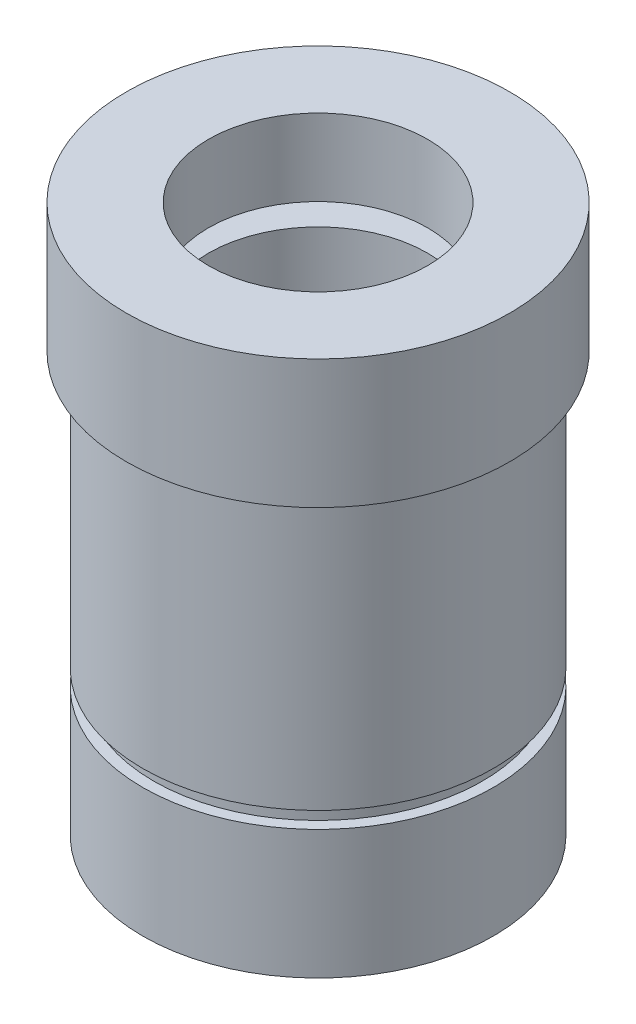
ISO-10303-21;
HEADER;
FILE_DESCRIPTION(('STEP AP214'),'2;1');
FILE_NAME('part.step','',(''),(''),'','','');
FILE_SCHEMA(('AUTOMOTIVE_DESIGN { 1 0 10303 214 1 1 1 1 }'));
ENDSEC;
DATA;
#1=APPLICATION_CONTEXT('core data for automotive mechanical design processes');
#2=APPLICATION_PROTOCOL_DEFINITION('international standard','automotive_design',2000,#1);
#3=PRODUCT_CONTEXT('',#1,'mechanical');
#4=PRODUCT('Part','Part','',(#3));
#5=PRODUCT_RELATED_PRODUCT_CATEGORY('part','',(#4));
#6=PRODUCT_DEFINITION_FORMATION('','',#4);
#7=PRODUCT_DEFINITION_CONTEXT('part definition',#1,'design');
#8=PRODUCT_DEFINITION('design','',#6,#7);
#9=PRODUCT_DEFINITION_SHAPE('','',#8);
#10=(LENGTH_UNIT() NAMED_UNIT(*) SI_UNIT(.MILLI.,.METRE.));
#11=(NAMED_UNIT(*) PLANE_ANGLE_UNIT() SI_UNIT($,.RADIAN.));
#12=(NAMED_UNIT(*) SI_UNIT($,.STERADIAN.) SOLID_ANGLE_UNIT());
#13=UNCERTAINTY_MEASURE_WITH_UNIT(LENGTH_MEASURE(1.E-05),#10,'distance_accuracy_value','');
#14=(GEOMETRIC_REPRESENTATION_CONTEXT(3) GLOBAL_UNCERTAINTY_ASSIGNED_CONTEXT((#13)) GLOBAL_UNIT_ASSIGNED_CONTEXT((#10,
#11,#12)) REPRESENTATION_CONTEXT('',''));
#15=CARTESIAN_POINT('',(0.,0.,0.));
#16=DIRECTION('',(0.,0.,1.));
#17=DIRECTION('',(1.,0.,0.));
#18=AXIS2_PLACEMENT_3D('',#15,#16,#17);
#19=CARTESIAN_POINT('',(0.,-26.8678822354766,0.));
#20=DIRECTION('',(0.,1.,0.));
#21=DIRECTION('',(0.,0.,1.));
#22=AXIS2_PLACEMENT_3D('',#19,#20,#21);
#23=CYLINDRICAL_SURFACE('',#22,10.);
#24=CARTESIAN_POINT('',(0.,14.1321177645234,0.));
#25=DIRECTION('',(0.,1.,0.));
#26=DIRECTION('',(0.,0.,1.));
#27=AXIS2_PLACEMENT_3D('',#24,#25,#26);
#28=CIRCLE('',#27,10.);
#29=CARTESIAN_POINT('',(0.,14.1321177645234,10.));
#30=VERTEX_POINT('',#29);
#31=EDGE_CURVE('E52',#30,#30,#28,.F.);
#32=CARTESIAN_POINT('',(0.,-17.8678822354766,0.));
#33=DIRECTION('',(0.,-1.,0.));
#34=DIRECTION('',(0.,0.,-1.));
#35=AXIS2_PLACEMENT_3D('',#32,#33,#34);
#36=CIRCLE('',#35,10.);
#37=CARTESIAN_POINT('',(0.,-17.8678822354766,10.));
#38=VERTEX_POINT('',#37);
#39=EDGE_CURVE('E36',#38,#38,#36,.F.);
#40=CARTESIAN_POINT('',(0.,14.1321177645234,10.));
#41=CARTESIAN_POINT('',(0.,13.7987844311901,10.));
#42=CARTESIAN_POINT('',(0.,13.4654510978568,10.));
#43=CARTESIAN_POINT('',(0.,12.7987844311901,10.));
#44=CARTESIAN_POINT('',(0.,12.4654510978568,10.));
#45=CARTESIAN_POINT('',(0.,11.7987844311901,10.));
#46=CARTESIAN_POINT('',(0.,11.4654510978568,10.));
#47=CARTESIAN_POINT('',(0.,10.7987844311901,10.));
#48=CARTESIAN_POINT('',(0.,10.4654510978568,10.));
#49=CARTESIAN_POINT('',(0.,9.7987844311901,10.));
#50=CARTESIAN_POINT('',(0.,9.46545109785677,10.));
#51=CARTESIAN_POINT('',(0.,8.7987844311901,10.));
#52=CARTESIAN_POINT('',(0.,8.46545109785676,10.));
#53=CARTESIAN_POINT('',(0.,7.7987844311901,10.));
#54=CARTESIAN_POINT('',(0.,7.46545109785677,10.));
#55=CARTESIAN_POINT('',(0.,6.7987844311901,10.));
#56=CARTESIAN_POINT('',(0.,6.46545109785677,10.));
#57=CARTESIAN_POINT('',(0.,5.7987844311901,10.));
#58=CARTESIAN_POINT('',(0.,5.46545109785677,10.));
#59=CARTESIAN_POINT('',(0.,4.7987844311901,10.));
#60=CARTESIAN_POINT('',(0.,4.46545109785677,10.));
#61=CARTESIAN_POINT('',(0.,3.79878443119011,10.));
#62=CARTESIAN_POINT('',(0.,3.46545109785677,10.));
#63=CARTESIAN_POINT('',(0.,2.7987844311901,10.));
#64=CARTESIAN_POINT('',(0.,2.46545109785677,10.));
#65=CARTESIAN_POINT('',(0.,1.7987844311901,10.));
#66=CARTESIAN_POINT('',(0.,1.46545109785677,10.));
#67=CARTESIAN_POINT('',(0.,0.798784431190106,10.));
#68=CARTESIAN_POINT('',(0.,0.465451097856772,10.));
#69=CARTESIAN_POINT('',(0.,-0.201215568809894,10.));
#70=CARTESIAN_POINT('',(0.,-0.534548902143226,10.));
#71=CARTESIAN_POINT('',(0.,-1.20121556880989,10.));
#72=CARTESIAN_POINT('',(0.,-1.53454890214323,10.));
#73=CARTESIAN_POINT('',(0.,-2.20121556880989,10.));
#74=CARTESIAN_POINT('',(0.,-2.53454890214323,10.));
#75=CARTESIAN_POINT('',(0.,-3.20121556880989,10.));
#76=CARTESIAN_POINT('',(0.,-3.53454890214323,10.));
#77=CARTESIAN_POINT('',(0.,-4.20121556880989,10.));
#78=CARTESIAN_POINT('',(0.,-4.53454890214323,10.));
#79=CARTESIAN_POINT('',(0.,-5.20121556880989,10.));
#80=CARTESIAN_POINT('',(0.,-5.53454890214322,10.));
#81=CARTESIAN_POINT('',(0.,-6.20121556880989,10.));
#82=CARTESIAN_POINT('',(0.,-6.53454890214322,10.));
#83=CARTESIAN_POINT('',(0.,-7.20121556880989,10.));
#84=CARTESIAN_POINT('',(0.,-7.53454890214322,10.));
#85=CARTESIAN_POINT('',(0.,-8.20121556880989,10.));
#86=CARTESIAN_POINT('',(0.,-8.53454890214322,10.));
#87=CARTESIAN_POINT('',(0.,-9.20121556880989,10.));
#88=CARTESIAN_POINT('',(0.,-9.53454890214322,10.));
#89=CARTESIAN_POINT('',(0.,-10.2012155688099,10.));
#90=CARTESIAN_POINT('',(0.,-10.5345489021432,10.));
#91=CARTESIAN_POINT('',(0.,-11.2012155688099,10.));
#92=CARTESIAN_POINT('',(0.,-11.5345489021432,10.));
#93=CARTESIAN_POINT('',(0.,-12.2012155688099,10.));
#94=CARTESIAN_POINT('',(0.,-12.5345489021432,10.));
#95=CARTESIAN_POINT('',(0.,-13.2012155688099,10.));
#96=CARTESIAN_POINT('',(0.,-13.5345489021432,10.));
#97=CARTESIAN_POINT('',(0.,-14.2012155688099,10.));
#98=CARTESIAN_POINT('',(0.,-14.5345489021432,10.));
#99=CARTESIAN_POINT('',(0.,-15.2012155688099,10.));
#100=CARTESIAN_POINT('',(0.,-15.5345489021432,10.));
#101=CARTESIAN_POINT('',(0.,-16.2012155688099,10.));
#102=CARTESIAN_POINT('',(0.,-16.5345489021432,10.));
#103=CARTESIAN_POINT('',(0.,-17.2012155688099,10.));
#104=CARTESIAN_POINT('',(0.,-17.5345489021432,10.));
#105=CARTESIAN_POINT('',(0.,-17.8678822354766,10.));
#106=B_SPLINE_CURVE_WITH_KNOTS('',3,(#40,#41,#42,#43,#44,#45,#46,#47,#48,#49,#50,#51,#52,#53,
#54,#55,#56,#57,#58,#59,#60,#61,#62,#63,#64,#65,#66,#67,#68,#69,#70,#71,#72,#73,#74,#75,#76,#77,
#78,#79,#80,#81,#82,#83,#84,#85,#86,#87,#88,#89,#90,#91,#92,#93,#94,#95,#96,#97,#98,#99,#100,
#101,#102,#103,#104,#105),.UNSPECIFIED.,.F.,.F.,(4,2,2,2,2,2,2,2,2,2,2,2,2,2,2,2,2,2,2,2,2,2,2,
2,2,2,2,2,2,2,2,2,4),(0.,1.,2.,3.,4.,5.,6.,7.,7.99999999999999,8.99999999999999,
9.99999999999999,11.,12.,13.,14.,15.,16.,17.,18.,19.,20.,21.,22.,23.,24.,25.,26.,27.,28.,29.,
30.,31.,32.),.UNSPECIFIED.);
#107=EDGE_CURVE('BSEAM32',#30,#38,#106,.T.);
#108=ORIENTED_EDGE('',*,*,#31,.F.);
#109=ORIENTED_EDGE('',*,*,#39,.F.);
#110=ORIENTED_EDGE('',*,*,#107,.T.);
#111=ORIENTED_EDGE('',*,*,#107,.F.);
#112=EDGE_LOOP('',(#108,#110,#109,#111));
#113=FACE_BOUND('',#112,.T.);
#114=ADVANCED_FACE('F32',(#113),#23,.F.);
#115=CARTESIAN_POINT('',(0.,-19.8678822354766,0.));
#116=DIRECTION('',(0.,-1.,0.));
#117=DIRECTION('',(0.,0.,-1.));
#118=AXIS2_PLACEMENT_3D('',#115,#116,#117);
#119=CIRCLE('',#118,10.);
#120=CARTESIAN_POINT('',(0.,-19.8678822354766,10.));
#121=VERTEX_POINT('',#120);
#122=EDGE_CURVE('E56',#121,#121,#119,.F.);
#123=CARTESIAN_POINT('',(0.,-26.8678822354766,0.));
#124=DIRECTION('',(0.,1.,0.));
#125=DIRECTION('',(0.,0.,1.));
#126=AXIS2_PLACEMENT_3D('',#123,#124,#125);
#127=CIRCLE('',#126,10.);
#128=CARTESIAN_POINT('',(0.,-26.8678822354766,10.));
#129=VERTEX_POINT('',#128);
#130=EDGE_CURVE('E75',#129,#129,#127,.T.);
#131=CARTESIAN_POINT('',(0.,-19.8678822354766,10.));
#132=CARTESIAN_POINT('',(0.,-19.9407989021432,10.));
#133=CARTESIAN_POINT('',(0.,-20.0137155688099,10.));
#134=CARTESIAN_POINT('',(0.,-20.1595489021432,10.));
#135=CARTESIAN_POINT('',(0.,-20.2324655688099,10.));
#136=CARTESIAN_POINT('',(0.,-20.3782989021432,10.));
#137=CARTESIAN_POINT('',(0.,-20.4512155688099,10.));
#138=CARTESIAN_POINT('',(0.,-20.5970489021432,10.));
#139=CARTESIAN_POINT('',(0.,-20.6699655688099,10.));
#140=CARTESIAN_POINT('',(0.,-20.8157989021432,10.));
#141=CARTESIAN_POINT('',(0.,-20.8887155688099,10.));
#142=CARTESIAN_POINT('',(0.,-21.0345489021432,10.));
#143=CARTESIAN_POINT('',(0.,-21.1074655688099,10.));
#144=CARTESIAN_POINT('',(0.,-21.2532989021432,10.));
#145=CARTESIAN_POINT('',(0.,-21.3262155688099,10.));
#146=CARTESIAN_POINT('',(0.,-21.4720489021432,10.));
#147=CARTESIAN_POINT('',(0.,-21.5449655688099,10.));
#148=CARTESIAN_POINT('',(0.,-21.6907989021432,10.));
#149=CARTESIAN_POINT('',(0.,-21.7637155688099,10.));
#150=CARTESIAN_POINT('',(0.,-21.9095489021432,10.));
#151=CARTESIAN_POINT('',(0.,-21.9824655688099,10.));
#152=CARTESIAN_POINT('',(0.,-22.1282989021432,10.));
#153=CARTESIAN_POINT('',(0.,-22.2012155688099,10.));
#154=CARTESIAN_POINT('',(0.,-22.3470489021432,10.));
#155=CARTESIAN_POINT('',(0.,-22.4199655688099,10.));
#156=CARTESIAN_POINT('',(0.,-22.5657989021432,10.));
#157=CARTESIAN_POINT('',(0.,-22.6387155688099,10.));
#158=CARTESIAN_POINT('',(0.,-22.7845489021432,10.));
#159=CARTESIAN_POINT('',(0.,-22.8574655688099,10.));
#160=CARTESIAN_POINT('',(0.,-23.0032989021432,10.));
#161=CARTESIAN_POINT('',(0.,-23.0762155688099,10.));
#162=CARTESIAN_POINT('',(0.,-23.2220489021432,10.));
#163=CARTESIAN_POINT('',(0.,-23.2949655688099,10.));
#164=CARTESIAN_POINT('',(0.,-23.4407989021432,10.));
#165=CARTESIAN_POINT('',(0.,-23.5137155688099,10.));
#166=CARTESIAN_POINT('',(0.,-23.6595489021432,10.));
#167=CARTESIAN_POINT('',(0.,-23.7324655688099,10.));
#168=CARTESIAN_POINT('',(0.,-23.8782989021432,10.));
#169=CARTESIAN_POINT('',(0.,-23.9512155688099,10.));
#170=CARTESIAN_POINT('',(0.,-24.0970489021432,10.));
#171=CARTESIAN_POINT('',(0.,-24.1699655688099,10.));
#172=CARTESIAN_POINT('',(0.,-24.3157989021432,10.));
#173=CARTESIAN_POINT('',(0.,-24.3887155688099,10.));
#174=CARTESIAN_POINT('',(0.,-24.5345489021432,10.));
#175=CARTESIAN_POINT('',(0.,-24.6074655688099,10.));
#176=CARTESIAN_POINT('',(0.,-24.7532989021432,10.));
#177=CARTESIAN_POINT('',(0.,-24.8262155688099,10.));
#178=CARTESIAN_POINT('',(0.,-24.9720489021432,10.));
#179=CARTESIAN_POINT('',(0.,-25.0449655688099,10.));
#180=CARTESIAN_POINT('',(0.,-25.1907989021432,10.));
#181=CARTESIAN_POINT('',(0.,-25.2637155688099,10.));
#182=CARTESIAN_POINT('',(0.,-25.4095489021432,10.));
#183=CARTESIAN_POINT('',(0.,-25.4824655688099,10.));
#184=CARTESIAN_POINT('',(0.,-25.6282989021432,10.));
#185=CARTESIAN_POINT('',(0.,-25.7012155688099,10.));
#186=CARTESIAN_POINT('',(0.,-25.8470489021432,10.));
#187=CARTESIAN_POINT('',(0.,-25.9199655688099,10.));
#188=CARTESIAN_POINT('',(0.,-26.0657989021432,10.));
#189=CARTESIAN_POINT('',(0.,-26.1387155688099,10.));
#190=CARTESIAN_POINT('',(0.,-26.2845489021432,10.));
#191=CARTESIAN_POINT('',(0.,-26.3574655688099,10.));
#192=CARTESIAN_POINT('',(0.,-26.5032989021432,10.));
#193=CARTESIAN_POINT('',(0.,-26.5762155688099,10.));
#194=CARTESIAN_POINT('',(0.,-26.7220489021432,10.));
#195=CARTESIAN_POINT('',(0.,-26.7949655688099,10.));
#196=CARTESIAN_POINT('',(0.,-26.8678822354766,10.));
#197=B_SPLINE_CURVE_WITH_KNOTS('',3,(#131,#132,#133,#134,#135,#136,#137,#138,#139,#140,#141,
#142,#143,#144,#145,#146,#147,#148,#149,#150,#151,#152,#153,#154,#155,#156,#157,#158,#159,#160,
#161,#162,#163,#164,#165,#166,#167,#168,#169,#170,#171,#172,#173,#174,#175,#176,#177,#178,#179,
#180,#181,#182,#183,#184,#185,#186,#187,#188,#189,#190,#191,#192,#193,#194,#195,#196),
.UNSPECIFIED.,.F.,.F.,(4,2,2,2,2,2,2,2,2,2,2,2,2,2,2,2,2,2,2,2,2,2,2,2,2,2,2,2,2,2,2,2,4),(0.,
0.21875,0.4375,0.656250000000001,0.875000000000001,1.09375,1.3125,1.53125,1.75,1.96875,2.1875,
2.40625,2.625,2.84375,3.0625,3.28125,3.5,3.71875,3.9375,4.15625,4.375,4.59375,4.8125,5.03125,
5.25,5.46875,5.68750000000001,5.90625000000001,6.12500000000001,6.34375000000001,
6.56250000000001,6.78125000000001,7.),.UNSPECIFIED.);
#198=EDGE_CURVE('BSEAM140',#121,#129,#197,.T.);
#199=ORIENTED_EDGE('',*,*,#122,.T.);
#200=ORIENTED_EDGE('',*,*,#130,.F.);
#201=ORIENTED_EDGE('',*,*,#198,.T.);
#202=ORIENTED_EDGE('',*,*,#198,.F.);
#203=EDGE_LOOP('',(#199,#201,#200,#202));
#204=FACE_BOUND('',#203,.T.);
#205=ADVANCED_FACE('F140',(#204),#23,.F.);
#206=CARTESIAN_POINT('',(0.,23.1321177645234,0.));
#207=DIRECTION('',(0.,-1.,0.));
#208=DIRECTION('',(0.,0.,-1.));
#209=AXIS2_PLACEMENT_3D('',#206,#207,#208);
#210=PLANE('',#209);
#211=CARTESIAN_POINT('',(0.,23.1321177645234,0.));
#212=DIRECTION('',(0.,1.,0.));
#213=DIRECTION('',(0.,0.,1.));
#214=AXIS2_PLACEMENT_3D('',#211,#212,#213);
#215=CIRCLE('',#214,10.);
#216=CARTESIAN_POINT('',(0.,23.1321177645234,10.));
#217=VERTEX_POINT('',#216);
#218=EDGE_CURVE('E55',#217,#217,#215,.T.);
#219=ORIENTED_EDGE('',*,*,#218,.F.);
#220=EDGE_LOOP('',(#219));
#221=FACE_BOUND('',#220,.T.);
#222=CARTESIAN_POINT('',(0.,23.1321177645234,0.));
#223=DIRECTION('',(0.,1.,0.));
#224=DIRECTION('',(0.,0.,1.));
#225=AXIS2_PLACEMENT_3D('',#222,#223,#224);
#226=CIRCLE('',#225,17.5);
#227=CARTESIAN_POINT('',(0.,23.1321177645234,17.5));
#228=VERTEX_POINT('',#227);
#229=EDGE_CURVE('E10',#228,#228,#226,.T.);
#230=ORIENTED_EDGE('',*,*,#229,.T.);
#231=EDGE_LOOP('',(#230));
#232=FACE_BOUND('',#231,.T.);
#233=ADVANCED_FACE('F34',(#221,#232),#210,.F.);
#234=CARTESIAN_POINT('',(0.,23.3627204030227,0.));
#235=DIRECTION('',(0.,1.,0.));
#236=DIRECTION('',(0.,0.,1.));
#237=AXIS2_PLACEMENT_3D('',#234,#235,#236);
#238=CYLINDRICAL_SURFACE('',#237,17.5);
#239=ORIENTED_EDGE('',*,*,#229,.F.);
#240=EDGE_LOOP('',(#239));
#241=FACE_BOUND('',#240,.T.);
#242=CARTESIAN_POINT('',(0.,11.3821177645234,0.));
#243=DIRECTION('',(0.,1.,0.));
#244=DIRECTION('',(0.,0.,1.));
#245=AXIS2_PLACEMENT_3D('',#242,#243,#244);
#246=CIRCLE('',#245,17.5);
#247=CARTESIAN_POINT('',(0.,11.3821177645234,17.5));
#248=VERTEX_POINT('',#247);
#249=EDGE_CURVE('E40',#248,#248,#246,.T.);
#250=ORIENTED_EDGE('',*,*,#249,.T.);
#251=EDGE_LOOP('',(#250));
#252=FACE_BOUND('',#251,.T.);
#253=ADVANCED_FACE('F256',(#241,#252),#238,.T.);
#254=CARTESIAN_POINT('',(17.5,11.3821177645234,0.));
#255=DIRECTION('',(0.,1.,0.));
#256=DIRECTION('',(0.,0.,1.));
#257=AXIS2_PLACEMENT_3D('',#254,#255,#256);
#258=PLANE('',#257);
#259=ORIENTED_EDGE('',*,*,#249,.F.);
#260=EDGE_LOOP('',(#259));
#261=FACE_BOUND('',#260,.T.);
#262=CARTESIAN_POINT('',(0.,11.3821177645234,0.));
#263=DIRECTION('',(0.,1.,0.));
#264=DIRECTION('',(0.,0.,1.));
#265=AXIS2_PLACEMENT_3D('',#262,#263,#264);
#266=CIRCLE('',#265,16.);
#267=CARTESIAN_POINT('',(0.,11.3821177645234,16.));
#268=VERTEX_POINT('',#267);
#269=EDGE_CURVE('E45',#268,#268,#266,.T.);
#270=ORIENTED_EDGE('',*,*,#269,.T.);
#271=EDGE_LOOP('',(#270));
#272=FACE_BOUND('',#271,.T.);
#273=ADVANCED_FACE('F97',(#261,#272),#258,.F.);
#274=CARTESIAN_POINT('',(0.,23.3627204030227,0.));
#275=DIRECTION('',(0.,1.,0.));
#276=DIRECTION('',(0.,0.,1.));
#277=AXIS2_PLACEMENT_3D('',#274,#275,#276);
#278=CYLINDRICAL_SURFACE('',#277,16.);
#279=ORIENTED_EDGE('',*,*,#269,.F.);
#280=EDGE_LOOP('',(#279));
#281=FACE_BOUND('',#280,.T.);
#282=CARTESIAN_POINT('',(0.,-13.6178822354766,0.));
#283=DIRECTION('',(0.,1.,0.));
#284=DIRECTION('',(0.,0.,1.));
#285=AXIS2_PLACEMENT_3D('',#282,#283,#284);
#286=CIRCLE('',#285,16.);
#287=CARTESIAN_POINT('',(0.,-13.6178822354766,16.));
#288=VERTEX_POINT('',#287);
#289=EDGE_CURVE('E92',#288,#288,#286,.T.);
#290=ORIENTED_EDGE('',*,*,#289,.T.);
#291=EDGE_LOOP('',(#290));
#292=FACE_BOUND('',#291,.T.);
#293=ADVANCED_FACE('F99',(#281,#292),#278,.T.);
#294=CARTESIAN_POINT('',(16.,-13.6178822354766,0.));
#295=DIRECTION('',(0.,1.,0.));
#296=DIRECTION('',(0.,0.,1.));
#297=AXIS2_PLACEMENT_3D('',#294,#295,#296);
#298=PLANE('',#297);
#299=ORIENTED_EDGE('',*,*,#289,.F.);
#300=EDGE_LOOP('',(#299));
#301=FACE_BOUND('',#300,.T.);
#302=CARTESIAN_POINT('',(0.,-13.6178822354766,0.));
#303=DIRECTION('',(0.,1.,0.));
#304=DIRECTION('',(0.,0.,1.));
#305=AXIS2_PLACEMENT_3D('',#302,#303,#304);
#306=CIRCLE('',#305,15.);
#307=CARTESIAN_POINT('',(0.,-13.6178822354766,15.));
#308=VERTEX_POINT('',#307);
#309=EDGE_CURVE('E89',#308,#308,#306,.T.);
#310=ORIENTED_EDGE('',*,*,#309,.T.);
#311=EDGE_LOOP('',(#310));
#312=FACE_BOUND('',#311,.T.);
#313=ADVANCED_FACE('F102',(#301,#312),#298,.F.);
#314=CARTESIAN_POINT('',(0.,23.3627204030227,0.));
#315=DIRECTION('',(0.,1.,0.));
#316=DIRECTION('',(0.,0.,1.));
#317=AXIS2_PLACEMENT_3D('',#314,#315,#316);
#318=CYLINDRICAL_SURFACE('',#317,15.);
#319=ORIENTED_EDGE('',*,*,#309,.F.);
#320=EDGE_LOOP('',(#319));
#321=FACE_BOUND('',#320,.T.);
#322=CARTESIAN_POINT('',(0.,-15.1178822354766,0.));
#323=DIRECTION('',(0.,1.,0.));
#324=DIRECTION('',(0.,0.,1.));
#325=AXIS2_PLACEMENT_3D('',#322,#323,#324);
#326=CIRCLE('',#325,15.);
#327=CARTESIAN_POINT('',(0.,-15.1178822354766,15.));
#328=VERTEX_POINT('',#327);
#329=EDGE_CURVE('E86',#328,#328,#326,.T.);
#330=ORIENTED_EDGE('',*,*,#329,.T.);
#331=EDGE_LOOP('',(#330));
#332=FACE_BOUND('',#331,.T.);
#333=ADVANCED_FACE('F108',(#321,#332),#318,.T.);
#334=CARTESIAN_POINT('',(15.,-15.1178822354766,0.));
#335=DIRECTION('',(0.,-1.,0.));
#336=DIRECTION('',(0.,0.,-1.));
#337=AXIS2_PLACEMENT_3D('',#334,#335,#336);
#338=PLANE('',#337);
#339=ORIENTED_EDGE('',*,*,#329,.F.);
#340=EDGE_LOOP('',(#339));
#341=FACE_BOUND('',#340,.T.);
#342=CARTESIAN_POINT('',(0.,-15.1178822354766,0.));
#343=DIRECTION('',(0.,1.,0.));
#344=DIRECTION('',(0.,0.,1.));
#345=AXIS2_PLACEMENT_3D('',#342,#343,#344);
#346=CIRCLE('',#345,16.);
#347=CARTESIAN_POINT('',(0.,-15.1178822354766,16.));
#348=VERTEX_POINT('',#347);
#349=EDGE_CURVE('E83',#348,#348,#346,.T.);
#350=ORIENTED_EDGE('',*,*,#349,.T.);
#351=EDGE_LOOP('',(#350));
#352=FACE_BOUND('',#351,.T.);
#353=ADVANCED_FACE('F114',(#341,#352),#338,.F.);
#354=CARTESIAN_POINT('',(0.,23.3627204030227,0.));
#355=DIRECTION('',(0.,1.,0.));
#356=DIRECTION('',(0.,0.,1.));
#357=AXIS2_PLACEMENT_3D('',#354,#355,#356);
#358=CYLINDRICAL_SURFACE('',#357,16.);
#359=ORIENTED_EDGE('',*,*,#349,.F.);
#360=EDGE_LOOP('',(#359));
#361=FACE_BOUND('',#360,.T.);
#362=CARTESIAN_POINT('',(0.,-26.8678822354766,0.));
#363=DIRECTION('',(0.,1.,0.));
#364=DIRECTION('',(0.,0.,1.));
#365=AXIS2_PLACEMENT_3D('',#362,#363,#364);
#366=CIRCLE('',#365,16.);
#367=CARTESIAN_POINT('',(0.,-26.8678822354766,16.));
#368=VERTEX_POINT('',#367);
#369=EDGE_CURVE('E78',#368,#368,#366,.T.);
#370=ORIENTED_EDGE('',*,*,#369,.T.);
#371=EDGE_LOOP('',(#370));
#372=FACE_BOUND('',#371,.T.);
#373=ADVANCED_FACE('F120',(#361,#372),#358,.T.);
#374=CARTESIAN_POINT('',(16.,-26.8678822354766,0.));
#375=DIRECTION('',(0.,1.,0.));
#376=DIRECTION('',(0.,0.,1.));
#377=AXIS2_PLACEMENT_3D('',#374,#375,#376);
#378=PLANE('',#377);
#379=ORIENTED_EDGE('',*,*,#130,.T.);
#380=EDGE_LOOP('',(#379));
#381=FACE_BOUND('',#380,.T.);
#382=ORIENTED_EDGE('',*,*,#369,.F.);
#383=EDGE_LOOP('',(#382));
#384=FACE_BOUND('',#383,.T.);
#385=ADVANCED_FACE('F126',(#381,#384),#378,.F.);
#386=CARTESIAN_POINT('',(0.,16.1321177645234,0.));
#387=DIRECTION('',(0.,1.,0.));
#388=DIRECTION('',(0.,0.,1.));
#389=AXIS2_PLACEMENT_3D('',#386,#387,#388);
#390=CIRCLE('',#389,10.);
#391=CARTESIAN_POINT('',(0.,16.1321177645234,10.));
#392=VERTEX_POINT('',#391);
#393=EDGE_CURVE('E49',#392,#392,#390,.F.);
#394=CARTESIAN_POINT('',(0.,16.1321177645234,10.));
#395=CARTESIAN_POINT('',(0.,16.2050344311901,10.));
#396=CARTESIAN_POINT('',(0.,16.2779510978568,10.));
#397=CARTESIAN_POINT('',(0.,16.4237844311901,10.));
#398=CARTESIAN_POINT('',(0.,16.4967010978568,10.));
#399=CARTESIAN_POINT('',(0.,16.6425344311901,10.));
#400=CARTESIAN_POINT('',(0.,16.7154510978568,10.));
#401=CARTESIAN_POINT('',(0.,16.8612844311901,10.));
#402=CARTESIAN_POINT('',(0.,16.9342010978568,10.));
#403=CARTESIAN_POINT('',(0.,17.0800344311901,10.));
#404=CARTESIAN_POINT('',(0.,17.1529510978568,10.));
#405=CARTESIAN_POINT('',(0.,17.2987844311901,10.));
#406=CARTESIAN_POINT('',(0.,17.3717010978568,10.));
#407=CARTESIAN_POINT('',(0.,17.5175344311901,10.));
#408=CARTESIAN_POINT('',(0.,17.5904510978568,10.));
#409=CARTESIAN_POINT('',(0.,17.7362844311901,10.));
#410=CARTESIAN_POINT('',(0.,17.8092010978568,10.));
#411=CARTESIAN_POINT('',(0.,17.9550344311901,10.));
#412=CARTESIAN_POINT('',(0.,18.0279510978568,10.));
#413=CARTESIAN_POINT('',(0.,18.1737844311901,10.));
#414=CARTESIAN_POINT('',(0.,18.2467010978568,10.));
#415=CARTESIAN_POINT('',(0.,18.3925344311901,10.));
#416=CARTESIAN_POINT('',(0.,18.4654510978568,10.));
#417=CARTESIAN_POINT('',(0.,18.6112844311901,10.));
#418=CARTESIAN_POINT('',(0.,18.6842010978568,10.));
#419=CARTESIAN_POINT('',(0.,18.8300344311901,10.));
#420=CARTESIAN_POINT('',(0.,18.9029510978568,10.));
#421=CARTESIAN_POINT('',(0.,19.0487844311901,10.));
#422=CARTESIAN_POINT('',(0.,19.1217010978568,10.));
#423=CARTESIAN_POINT('',(0.,19.2675344311901,10.));
#424=CARTESIAN_POINT('',(0.,19.3404510978568,10.));
#425=CARTESIAN_POINT('',(0.,19.4862844311901,10.));
#426=CARTESIAN_POINT('',(0.,19.5592010978568,10.));
#427=CARTESIAN_POINT('',(0.,19.7050344311901,10.));
#428=CARTESIAN_POINT('',(0.,19.7779510978568,10.));
#429=CARTESIAN_POINT('',(0.,19.9237844311901,10.));
#430=CARTESIAN_POINT('',(0.,19.9967010978568,10.));
#431=CARTESIAN_POINT('',(0.,20.1425344311901,10.));
#432=CARTESIAN_POINT('',(0.,20.2154510978568,10.));
#433=CARTESIAN_POINT('',(0.,20.3612844311901,10.));
#434=CARTESIAN_POINT('',(0.,20.4342010978568,10.));
#435=CARTESIAN_POINT('',(0.,20.5800344311901,10.));
#436=CARTESIAN_POINT('',(0.,20.6529510978568,10.));
#437=CARTESIAN_POINT('',(0.,20.7987844311901,10.));
#438=CARTESIAN_POINT('',(0.,20.8717010978568,10.));
#439=CARTESIAN_POINT('',(0.,21.0175344311901,10.));
#440=CARTESIAN_POINT('',(0.,21.0904510978568,10.));
#441=CARTESIAN_POINT('',(0.,21.2362844311901,10.));
#442=CARTESIAN_POINT('',(0.,21.3092010978568,10.));
#443=CARTESIAN_POINT('',(0.,21.4550344311901,10.));
#444=CARTESIAN_POINT('',(0.,21.5279510978568,10.));
#445=CARTESIAN_POINT('',(0.,21.6737844311901,10.));
#446=CARTESIAN_POINT('',(0.,21.7467010978568,10.));
#447=CARTESIAN_POINT('',(0.,21.8925344311901,10.));
#448=CARTESIAN_POINT('',(0.,21.9654510978568,10.));
#449=CARTESIAN_POINT('',(0.,22.1112844311901,10.));
#450=CARTESIAN_POINT('',(0.,22.1842010978568,10.));
#451=CARTESIAN_POINT('',(0.,22.3300344311901,10.));
#452=CARTESIAN_POINT('',(0.,22.4029510978568,10.));
#453=CARTESIAN_POINT('',(0.,22.5487844311901,10.));
#454=CARTESIAN_POINT('',(0.,22.6217010978568,10.));
#455=CARTESIAN_POINT('',(0.,22.7675344311901,10.));
#456=CARTESIAN_POINT('',(0.,22.8404510978568,10.));
#457=CARTESIAN_POINT('',(0.,22.9862844311901,10.));
#458=CARTESIAN_POINT('',(0.,23.0592010978568,10.));
#459=CARTESIAN_POINT('',(0.,23.1321177645234,10.));
#460=B_SPLINE_CURVE_WITH_KNOTS('',3,(#394,#395,#396,#397,#398,#399,#400,#401,#402,#403,#404,
#405,#406,#407,#408,#409,#410,#411,#412,#413,#414,#415,#416,#417,#418,#419,#420,#421,#422,#423,
#424,#425,#426,#427,#428,#429,#430,#431,#432,#433,#434,#435,#436,#437,#438,#439,#440,#441,#442,
#443,#444,#445,#446,#447,#448,#449,#450,#451,#452,#453,#454,#455,#456,#457,#458,#459),
.UNSPECIFIED.,.F.,.F.,(4,2,2,2,2,2,2,2,2,2,2,2,2,2,2,2,2,2,2,2,2,2,2,2,2,2,2,2,2,2,2,2,4),(0.,
0.218750000000004,0.4375,0.656249999999997,0.875000000000001,1.09375,1.3125,1.53125,1.75,
1.96875000000001,2.1875,2.40625,2.625,2.84375000000001,3.0625,3.28125,3.5,3.71875000000001,
3.9375,4.15625,4.375,4.59375000000001,4.8125,5.03125,5.25,5.46875000000001,5.68750000000001,
5.90625,6.12500000000001,6.34375000000001,6.56250000000001,6.78125,7.00000000000001),.UNSPECIFIED.);
#461=EDGE_CURVE('BSEAM131',#392,#217,#460,.T.);
#462=ORIENTED_EDGE('',*,*,#393,.T.);
#463=ORIENTED_EDGE('',*,*,#218,.T.);
#464=ORIENTED_EDGE('',*,*,#461,.T.);
#465=ORIENTED_EDGE('',*,*,#461,.F.);
#466=EDGE_LOOP('',(#462,#464,#463,#465));
#467=FACE_BOUND('',#466,.T.);
#468=ADVANCED_FACE('F131',(#467),#23,.F.);
#469=CARTESIAN_POINT('',(0.,14.1321177645234,0.));
#470=DIRECTION('',(0.,1.,0.));
#471=DIRECTION('',(0.,0.,1.));
#472=AXIS2_PLACEMENT_3D('',#469,#470,#471);
#473=PLANE('',#472);
#474=CARTESIAN_POINT('',(0.,14.1321177645234,0.));
#475=DIRECTION('',(0.,1.,0.));
#476=DIRECTION('',(0.,0.,1.));
#477=AXIS2_PLACEMENT_3D('',#474,#475,#476);
#478=CIRCLE('',#477,13.);
#479=CARTESIAN_POINT('',(0.,14.1321177645234,13.));
#480=VERTEX_POINT('',#479);
#481=EDGE_CURVE('E53',#480,#480,#478,.T.);
#482=ORIENTED_EDGE('',*,*,#481,.T.);
#483=EDGE_LOOP('',(#482));
#484=FACE_BOUND('',#483,.T.);
#485=ORIENTED_EDGE('',*,*,#31,.T.);
#486=EDGE_LOOP('',(#485));
#487=FACE_BOUND('',#486,.T.);
#488=ADVANCED_FACE('F137',(#484,#487),#473,.T.);
#489=CARTESIAN_POINT('',(0.,16.1321177645234,0.));
#490=DIRECTION('',(0.,1.,0.));
#491=DIRECTION('',(0.,0.,1.));
#492=AXIS2_PLACEMENT_3D('',#489,#490,#491);
#493=PLANE('',#492);
#494=CARTESIAN_POINT('',(0.,16.1321177645234,0.));
#495=DIRECTION('',(0.,1.,0.));
#496=DIRECTION('',(0.,0.,1.));
#497=AXIS2_PLACEMENT_3D('',#494,#495,#496);
#498=CIRCLE('',#497,13.);
#499=CARTESIAN_POINT('',(0.,16.1321177645234,13.));
#500=VERTEX_POINT('',#499);
#501=EDGE_CURVE('E62',#500,#500,#498,.T.);
#502=ORIENTED_EDGE('',*,*,#501,.F.);
#503=EDGE_LOOP('',(#502));
#504=FACE_BOUND('',#503,.T.);
#505=ORIENTED_EDGE('',*,*,#393,.F.);
#506=EDGE_LOOP('',(#505));
#507=FACE_BOUND('',#506,.T.);
#508=ADVANCED_FACE('F153',(#504,#507),#493,.F.);
#509=CARTESIAN_POINT('',(0.,14.1321177645234,0.));
#510=DIRECTION('',(0.,1.,0.));
#511=DIRECTION('',(0.,0.,1.));
#512=AXIS2_PLACEMENT_3D('',#509,#510,#511);
#513=CYLINDRICAL_SURFACE('',#512,13.);
#514=ORIENTED_EDGE('',*,*,#481,.F.);
#515=EDGE_LOOP('',(#514));
#516=FACE_BOUND('',#515,.T.);
#517=ORIENTED_EDGE('',*,*,#501,.T.);
#518=EDGE_LOOP('',(#517));
#519=FACE_BOUND('',#518,.T.);
#520=ADVANCED_FACE('F149',(#516,#519),#513,.F.);
#521=CARTESIAN_POINT('',(0.,-17.8678822354766,0.));
#522=DIRECTION('',(0.,-1.,0.));
#523=DIRECTION('',(0.,0.,-1.));
#524=AXIS2_PLACEMENT_3D('',#521,#522,#523);
#525=PLANE('',#524);
#526=CARTESIAN_POINT('',(0.,-17.8678822354766,0.));
#527=DIRECTION('',(0.,-1.,0.));
#528=DIRECTION('',(0.,0.,-1.));
#529=AXIS2_PLACEMENT_3D('',#526,#527,#528);
#530=CIRCLE('',#529,13.);
#531=CARTESIAN_POINT('',(0.,-17.8678822354766,-13.));
#532=VERTEX_POINT('',#531);
#533=EDGE_CURVE('E58',#532,#532,#530,.T.);
#534=ORIENTED_EDGE('',*,*,#533,.T.);
#535=EDGE_LOOP('',(#534));
#536=FACE_BOUND('',#535,.T.);
#537=ORIENTED_EDGE('',*,*,#39,.T.);
#538=EDGE_LOOP('',(#537));
#539=FACE_BOUND('',#538,.T.);
#540=ADVANCED_FACE('F152',(#536,#539),#525,.T.);
#541=CARTESIAN_POINT('',(0.,-19.8678822354766,0.));
#542=DIRECTION('',(0.,-1.,0.));
#543=DIRECTION('',(0.,0.,-1.));
#544=AXIS2_PLACEMENT_3D('',#541,#542,#543);
#545=PLANE('',#544);
#546=CARTESIAN_POINT('',(0.,-19.8678822354766,0.));
#547=DIRECTION('',(0.,-1.,0.));
#548=DIRECTION('',(0.,0.,-1.));
#549=AXIS2_PLACEMENT_3D('',#546,#547,#548);
#550=CIRCLE('',#549,13.);
#551=CARTESIAN_POINT('',(0.,-19.8678822354766,-13.));
#552=VERTEX_POINT('',#551);
#553=EDGE_CURVE('E64',#552,#552,#550,.T.);
#554=ORIENTED_EDGE('',*,*,#553,.F.);
#555=EDGE_LOOP('',(#554));
#556=FACE_BOUND('',#555,.T.);
#557=ORIENTED_EDGE('',*,*,#122,.F.);
#558=EDGE_LOOP('',(#557));
#559=FACE_BOUND('',#558,.T.);
#560=ADVANCED_FACE('F164',(#556,#559),#545,.F.);
#561=CARTESIAN_POINT('',(0.,-17.8678822354766,0.));
#562=DIRECTION('',(0.,-1.,0.));
#563=DIRECTION('',(0.,0.,-1.));
#564=AXIS2_PLACEMENT_3D('',#561,#562,#563);
#565=CYLINDRICAL_SURFACE('',#564,13.);
#566=ORIENTED_EDGE('',*,*,#533,.F.);
#567=EDGE_LOOP('',(#566));
#568=FACE_BOUND('',#567,.T.);
#569=ORIENTED_EDGE('',*,*,#553,.T.);
#570=EDGE_LOOP('',(#569));
#571=FACE_BOUND('',#570,.T.);
#572=ADVANCED_FACE('F161',(#568,#571),#565,.F.);
#573=CLOSED_SHELL('',(#114,#205,#233,#253,#273,#293,#313,#333,#353,#373,#385,#468,#488,#508,
#520,#540,#560,#572));
#574=MANIFOLD_SOLID_BREP('B2',#573);
#575=ADVANCED_BREP_SHAPE_REPRESENTATION('',(#18,#574),#14);
#576=SHAPE_DEFINITION_REPRESENTATION(#9,#575);
ENDSEC;
END-ISO-10303-21;
